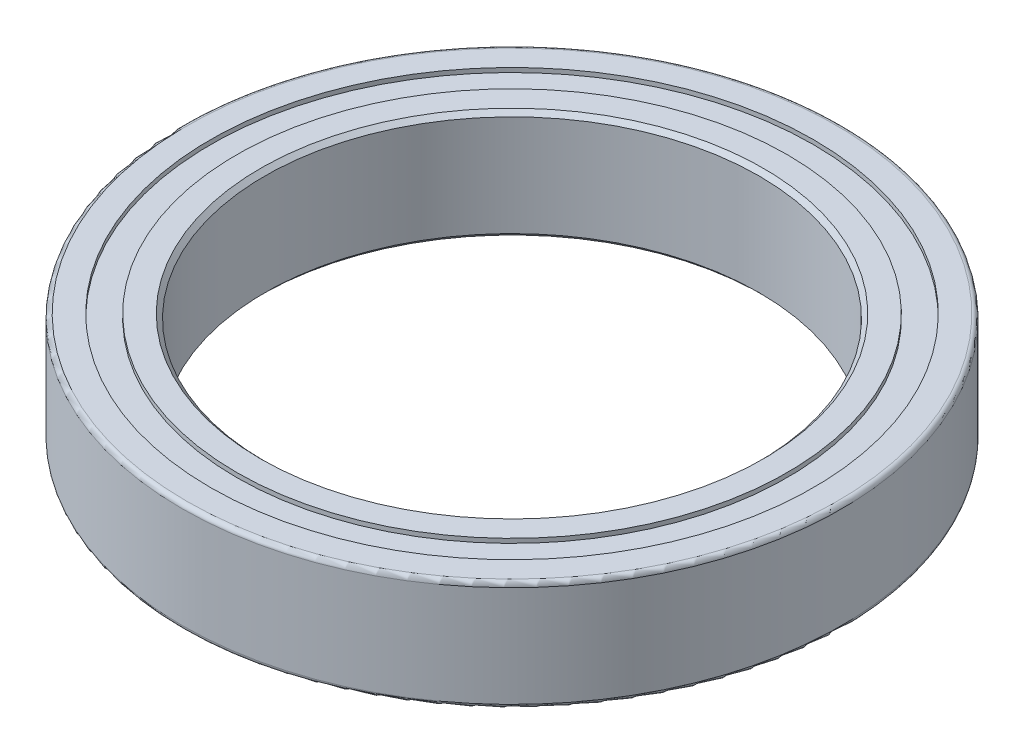
ISO-10303-21;
HEADER;
FILE_DESCRIPTION(('STEP AP214'),'2;1');
FILE_NAME('part.step','',(''),(''),'','','');
FILE_SCHEMA(('AUTOMOTIVE_DESIGN { 1 0 10303 214 1 1 1 1 }'));
ENDSEC;
DATA;
#1=APPLICATION_CONTEXT('core data for automotive mechanical design processes');
#2=APPLICATION_PROTOCOL_DEFINITION('international standard','automotive_design',2000,#1);
#3=PRODUCT_CONTEXT('',#1,'mechanical');
#4=PRODUCT('Part','Part','',(#3));
#5=PRODUCT_RELATED_PRODUCT_CATEGORY('part','',(#4));
#6=PRODUCT_DEFINITION_FORMATION('','',#4);
#7=PRODUCT_DEFINITION_CONTEXT('part definition',#1,'design');
#8=PRODUCT_DEFINITION('design','',#6,#7);
#9=PRODUCT_DEFINITION_SHAPE('','',#8);
#10=(LENGTH_UNIT() NAMED_UNIT(*) SI_UNIT(.MILLI.,.METRE.));
#11=(NAMED_UNIT(*) PLANE_ANGLE_UNIT() SI_UNIT($,.RADIAN.));
#12=(NAMED_UNIT(*) SI_UNIT($,.STERADIAN.) SOLID_ANGLE_UNIT());
#13=UNCERTAINTY_MEASURE_WITH_UNIT(LENGTH_MEASURE(1.E-05),#10,'distance_accuracy_value','');
#14=(GEOMETRIC_REPRESENTATION_CONTEXT(3) GLOBAL_UNCERTAINTY_ASSIGNED_CONTEXT((#13)) GLOBAL_UNIT_ASSIGNED_CONTEXT((#10,
#11,#12)) REPRESENTATION_CONTEXT('',''));
#15=CARTESIAN_POINT('',(0.,0.,0.));
#16=DIRECTION('',(0.,0.,1.));
#17=DIRECTION('',(1.,0.,0.));
#18=AXIS2_PLACEMENT_3D('',#15,#16,#17);
#19=CARTESIAN_POINT('',(0.,1.5875,0.));
#20=DIRECTION('',(0.,-1.,0.));
#21=DIRECTION('',(0.,0.,-1.));
#22=AXIS2_PLACEMENT_3D('',#19,#20,#21);
#23=CYLINDRICAL_SURFACE('',#22,8.7122);
#24=CARTESIAN_POINT('',(0.,-1.5875,0.));
#25=DIRECTION('',(0.,1.,0.));
#26=DIRECTION('',(0.,0.,1.));
#27=AXIS2_PLACEMENT_3D('',#24,#25,#26);
#28=CIRCLE('',#27,8.7122);
#29=CARTESIAN_POINT('',(0.,-1.5875,8.7122));
#30=VERTEX_POINT('',#29);
#31=EDGE_CURVE('E69',#30,#30,#28,.T.);
#32=ORIENTED_EDGE('',*,*,#31,.F.);
#33=EDGE_LOOP('',(#32));
#34=FACE_BOUND('',#33,.T.);
#35=CARTESIAN_POINT('',(0.,-1.4605,0.));
#36=DIRECTION('',(0.,1.,0.));
#37=DIRECTION('',(0.,0.,1.));
#38=AXIS2_PLACEMENT_3D('',#35,#36,#37);
#39=CIRCLE('',#38,8.7122);
#40=CARTESIAN_POINT('',(0.,-1.4605,8.7122));
#41=VERTEX_POINT('',#40);
#42=EDGE_CURVE('E72',#41,#41,#39,.T.);
#43=ORIENTED_EDGE('',*,*,#42,.T.);
#44=EDGE_LOOP('',(#43));
#45=FACE_BOUND('',#44,.T.);
#46=ADVANCED_FACE('F45',(#34,#45),#23,.F.);
#47=CARTESIAN_POINT('',(0.,1.4605,0.));
#48=DIRECTION('',(0.,1.,0.));
#49=DIRECTION('',(0.,0.,1.));
#50=AXIS2_PLACEMENT_3D('',#47,#48,#49);
#51=CIRCLE('',#50,8.7122);
#52=CARTESIAN_POINT('',(0.,1.4605,8.7122));
#53=VERTEX_POINT('',#52);
#54=EDGE_CURVE('E11',#53,#53,#51,.T.);
#55=ORIENTED_EDGE('',*,*,#54,.F.);
#56=EDGE_LOOP('',(#55));
#57=FACE_BOUND('',#56,.T.);
#58=CARTESIAN_POINT('',(0.,1.5875,0.));
#59=DIRECTION('',(0.,1.,0.));
#60=DIRECTION('',(0.,0.,1.));
#61=AXIS2_PLACEMENT_3D('',#58,#59,#60);
#62=CIRCLE('',#61,8.7122);
#63=CARTESIAN_POINT('',(0.,1.5875,8.7122));
#64=VERTEX_POINT('',#63);
#65=EDGE_CURVE('E68',#64,#64,#62,.T.);
#66=ORIENTED_EDGE('',*,*,#65,.T.);
#67=EDGE_LOOP('',(#66));
#68=FACE_BOUND('',#67,.T.);
#69=ADVANCED_FACE('F124',(#57,#68),#23,.F.);
#70=CARTESIAN_POINT('',(0.,1.5875,0.));
#71=DIRECTION('',(0.,-1.,0.));
#72=DIRECTION('',(0.,0.,-1.));
#73=AXIS2_PLACEMENT_3D('',#70,#71,#72);
#74=CYLINDRICAL_SURFACE('',#73,9.525);
#75=CARTESIAN_POINT('',(0.,-1.4605,0.));
#76=DIRECTION('',(0.,1.,0.));
#77=DIRECTION('',(0.,0.,1.));
#78=AXIS2_PLACEMENT_3D('',#75,#76,#77);
#79=CIRCLE('',#78,9.525);
#80=CARTESIAN_POINT('',(0.,-1.4605,9.525));
#81=VERTEX_POINT('',#80);
#82=EDGE_CURVE('E60',#81,#81,#79,.T.);
#83=ORIENTED_EDGE('',*,*,#82,.T.);
#84=EDGE_LOOP('',(#83));
#85=FACE_BOUND('',#84,.T.);
#86=CARTESIAN_POINT('',(0.,1.4605,0.));
#87=DIRECTION('',(0.,1.,0.));
#88=DIRECTION('',(0.,0.,1.));
#89=AXIS2_PLACEMENT_3D('',#86,#87,#88);
#90=CIRCLE('',#89,9.525);
#91=CARTESIAN_POINT('',(0.,1.4605,9.525));
#92=VERTEX_POINT('',#91);
#93=EDGE_CURVE('E65',#92,#92,#90,.F.);
#94=ORIENTED_EDGE('',*,*,#93,.T.);
#95=EDGE_LOOP('',(#94));
#96=FACE_BOUND('',#95,.T.);
#97=ADVANCED_FACE('F131',(#85,#96),#74,.T.);
#98=CARTESIAN_POINT('',(0.,1.5875,0.));
#99=DIRECTION('',(0.,1.,0.));
#100=DIRECTION('',(0.,0.,1.));
#101=AXIS2_PLACEMENT_3D('',#98,#99,#100);
#102=PLANE('',#101);
#103=CARTESIAN_POINT('',(0.,1.5875,0.));
#104=DIRECTION('',(0.,1.,0.));
#105=DIRECTION('',(0.,0.,1.));
#106=AXIS2_PLACEMENT_3D('',#103,#104,#105);
#107=CIRCLE('',#106,9.398);
#108=CARTESIAN_POINT('',(0.,1.5875,9.398));
#109=VERTEX_POINT('',#108);
#110=EDGE_CURVE('E52',#109,#109,#107,.T.);
#111=ORIENTED_EDGE('',*,*,#110,.T.);
#112=EDGE_LOOP('',(#111));
#113=FACE_BOUND('',#112,.T.);
#114=ORIENTED_EDGE('',*,*,#65,.F.);
#115=EDGE_LOOP('',(#114));
#116=FACE_BOUND('',#115,.T.);
#117=ADVANCED_FACE('F148',(#113,#116),#102,.T.);
#118=CARTESIAN_POINT('',(0.,-1.5875,0.));
#119=DIRECTION('',(0.,1.,0.));
#120=DIRECTION('',(0.,0.,1.));
#121=AXIS2_PLACEMENT_3D('',#118,#119,#120);
#122=PLANE('',#121);
#123=CARTESIAN_POINT('',(0.,-1.5875,0.));
#124=DIRECTION('',(0.,1.,0.));
#125=DIRECTION('',(0.,0.,1.));
#126=AXIS2_PLACEMENT_3D('',#123,#124,#125);
#127=CIRCLE('',#126,9.398);
#128=CARTESIAN_POINT('',(0.,-1.5875,9.398));
#129=VERTEX_POINT('',#128);
#130=EDGE_CURVE('E56',#129,#129,#127,.F.);
#131=ORIENTED_EDGE('',*,*,#130,.T.);
#132=EDGE_LOOP('',(#131));
#133=FACE_BOUND('',#132,.T.);
#134=ORIENTED_EDGE('',*,*,#31,.T.);
#135=EDGE_LOOP('',(#134));
#136=FACE_BOUND('',#135,.T.);
#137=ADVANCED_FACE('F139',(#133,#136),#122,.F.);
#138=CARTESIAN_POINT('',(0.,-1.4605,0.));
#139=DIRECTION('',(0.,1.,0.));
#140=DIRECTION('',(0.,0.,1.));
#141=AXIS2_PLACEMENT_3D('',#138,#139,#140);
#142=TOROIDAL_SURFACE('',#141,9.398,0.127);
#143=ORIENTED_EDGE('',*,*,#130,.F.);
#144=EDGE_LOOP('',(#143));
#145=FACE_BOUND('',#144,.T.);
#146=ORIENTED_EDGE('',*,*,#82,.F.);
#147=EDGE_LOOP('',(#146));
#148=FACE_BOUND('',#147,.T.);
#149=ADVANCED_FACE('F137',(#145,#148),#142,.T.);
#150=CARTESIAN_POINT('',(0.,1.4605,0.));
#151=DIRECTION('',(0.,1.,0.));
#152=DIRECTION('',(0.,0.,1.));
#153=AXIS2_PLACEMENT_3D('',#150,#151,#152);
#154=TOROIDAL_SURFACE('',#153,9.398,0.127);
#155=ORIENTED_EDGE('',*,*,#93,.F.);
#156=EDGE_LOOP('',(#155));
#157=FACE_BOUND('',#156,.T.);
#158=ORIENTED_EDGE('',*,*,#110,.F.);
#159=EDGE_LOOP('',(#158));
#160=FACE_BOUND('',#159,.T.);
#161=ADVANCED_FACE('F47',(#157,#160),#154,.T.);
#162=CARTESIAN_POINT('',(0.,1.4605,0.));
#163=DIRECTION('',(0.,1.,0.));
#164=DIRECTION('',(0.,0.,1.));
#165=AXIS2_PLACEMENT_3D('',#162,#163,#164);
#166=PLANE('',#165);
#167=ORIENTED_EDGE('',*,*,#54,.T.);
#168=EDGE_LOOP('',(#167));
#169=FACE_BOUND('',#168,.T.);
#170=CARTESIAN_POINT('',(0.,1.4605,0.));
#171=DIRECTION('',(0.,1.,0.));
#172=DIRECTION('',(0.,0.,1.));
#173=AXIS2_PLACEMENT_3D('',#170,#171,#172);
#174=CIRCLE('',#173,7.95655);
#175=CARTESIAN_POINT('',(0.,1.4605,7.95655));
#176=VERTEX_POINT('',#175);
#177=EDGE_CURVE('E77',#176,#176,#174,.T.);
#178=ORIENTED_EDGE('',*,*,#177,.F.);
#179=EDGE_LOOP('',(#178));
#180=FACE_BOUND('',#179,.T.);
#181=ADVANCED_FACE('F145',(#169,#180),#166,.T.);
#182=CARTESIAN_POINT('',(0.,-1.4605,0.));
#183=DIRECTION('',(0.,1.,0.));
#184=DIRECTION('',(0.,0.,1.));
#185=AXIS2_PLACEMENT_3D('',#182,#183,#184);
#186=PLANE('',#185);
#187=ORIENTED_EDGE('',*,*,#42,.F.);
#188=EDGE_LOOP('',(#187));
#189=FACE_BOUND('',#188,.T.);
#190=CARTESIAN_POINT('',(0.,-1.4605,0.));
#191=DIRECTION('',(0.,1.,0.));
#192=DIRECTION('',(0.,0.,1.));
#193=AXIS2_PLACEMENT_3D('',#190,#191,#192);
#194=CIRCLE('',#193,7.95655);
#195=CARTESIAN_POINT('',(0.,-1.4605,7.95655));
#196=VERTEX_POINT('',#195);
#197=EDGE_CURVE('E80',#196,#196,#194,.F.);
#198=ORIENTED_EDGE('',*,*,#197,.F.);
#199=EDGE_LOOP('',(#198));
#200=FACE_BOUND('',#199,.T.);
#201=ADVANCED_FACE('F121',(#189,#200),#186,.F.);
#202=CARTESIAN_POINT('',(0.,1.5875,0.));
#203=DIRECTION('',(0.,-1.,0.));
#204=DIRECTION('',(0.,0.,-1.));
#205=AXIS2_PLACEMENT_3D('',#202,#203,#204);
#206=CYLINDRICAL_SURFACE('',#205,7.95655);
#207=CARTESIAN_POINT('',(0.,-1.5875,0.));
#208=DIRECTION('',(0.,1.,0.));
#209=DIRECTION('',(0.,0.,1.));
#210=AXIS2_PLACEMENT_3D('',#207,#208,#209);
#211=CIRCLE('',#210,7.95655);
#212=CARTESIAN_POINT('',(0.,-1.5875,7.95655));
#213=VERTEX_POINT('',#212);
#214=EDGE_CURVE('E96',#213,#213,#211,.T.);
#215=ORIENTED_EDGE('',*,*,#214,.T.);
#216=EDGE_LOOP('',(#215));
#217=FACE_BOUND('',#216,.T.);
#218=ORIENTED_EDGE('',*,*,#197,.T.);
#219=EDGE_LOOP('',(#218));
#220=FACE_BOUND('',#219,.T.);
#221=ADVANCED_FACE('F109',(#217,#220),#206,.T.);
#222=CARTESIAN_POINT('',(0.,1.5875,0.));
#223=DIRECTION('',(0.,-1.,0.));
#224=DIRECTION('',(0.,0.,-1.));
#225=AXIS2_PLACEMENT_3D('',#222,#223,#224);
#226=CYLINDRICAL_SURFACE('',#225,7.14375);
#227=CARTESIAN_POINT('',(0.,-1.4605,0.));
#228=DIRECTION('',(0.,1.,0.));
#229=DIRECTION('',(0.,0.,1.));
#230=AXIS2_PLACEMENT_3D('',#227,#228,#229);
#231=CIRCLE('',#230,7.14375);
#232=CARTESIAN_POINT('',(0.,-1.4605,7.14375));
#233=VERTEX_POINT('',#232);
#234=EDGE_CURVE('E86',#233,#233,#231,.F.);
#235=ORIENTED_EDGE('',*,*,#234,.T.);
#236=EDGE_LOOP('',(#235));
#237=FACE_BOUND('',#236,.T.);
#238=CARTESIAN_POINT('',(0.,1.4605,0.));
#239=DIRECTION('',(0.,1.,0.));
#240=DIRECTION('',(0.,0.,1.));
#241=AXIS2_PLACEMENT_3D('',#238,#239,#240);
#242=CIRCLE('',#241,7.14375);
#243=CARTESIAN_POINT('',(0.,1.4605,7.14375));
#244=VERTEX_POINT('',#243);
#245=EDGE_CURVE('E89',#244,#244,#242,.T.);
#246=ORIENTED_EDGE('',*,*,#245,.T.);
#247=EDGE_LOOP('',(#246));
#248=FACE_BOUND('',#247,.T.);
#249=ADVANCED_FACE('F106',(#237,#248),#226,.F.);
#250=ORIENTED_EDGE('',*,*,#177,.T.);
#251=EDGE_LOOP('',(#250));
#252=FACE_BOUND('',#251,.T.);
#253=CARTESIAN_POINT('',(0.,1.5875,0.));
#254=DIRECTION('',(0.,1.,0.));
#255=DIRECTION('',(0.,0.,1.));
#256=AXIS2_PLACEMENT_3D('',#253,#254,#255);
#257=CIRCLE('',#256,7.95655);
#258=CARTESIAN_POINT('',(0.,1.5875,7.95655));
#259=VERTEX_POINT('',#258);
#260=EDGE_CURVE('E95',#259,#259,#257,.T.);
#261=ORIENTED_EDGE('',*,*,#260,.F.);
#262=EDGE_LOOP('',(#261));
#263=FACE_BOUND('',#262,.T.);
#264=ADVANCED_FACE('F104',(#252,#263),#206,.T.);
#265=CARTESIAN_POINT('',(0.,1.5875,0.));
#266=DIRECTION('',(0.,1.,0.));
#267=DIRECTION('',(0.,0.,1.));
#268=AXIS2_PLACEMENT_3D('',#265,#266,#267);
#269=PLANE('',#268);
#270=CARTESIAN_POINT('',(0.,1.5875,0.));
#271=DIRECTION('',(0.,1.,0.));
#272=DIRECTION('',(0.,0.,1.));
#273=AXIS2_PLACEMENT_3D('',#270,#271,#272);
#274=CIRCLE('',#273,7.27075);
#275=CARTESIAN_POINT('',(0.,1.5875,7.27075));
#276=VERTEX_POINT('',#275);
#277=EDGE_CURVE('E83',#276,#276,#274,.F.);
#278=ORIENTED_EDGE('',*,*,#277,.T.);
#279=EDGE_LOOP('',(#278));
#280=FACE_BOUND('',#279,.T.);
#281=ORIENTED_EDGE('',*,*,#260,.T.);
#282=EDGE_LOOP('',(#281));
#283=FACE_BOUND('',#282,.T.);
#284=ADVANCED_FACE('F102',(#280,#283),#269,.T.);
#285=CARTESIAN_POINT('',(0.,-1.5875,0.));
#286=DIRECTION('',(0.,1.,0.));
#287=DIRECTION('',(0.,0.,1.));
#288=AXIS2_PLACEMENT_3D('',#285,#286,#287);
#289=PLANE('',#288);
#290=CARTESIAN_POINT('',(0.,-1.5875,0.));
#291=DIRECTION('',(0.,1.,0.));
#292=DIRECTION('',(0.,0.,1.));
#293=AXIS2_PLACEMENT_3D('',#290,#291,#292);
#294=CIRCLE('',#293,7.27075);
#295=CARTESIAN_POINT('',(0.,-1.5875,7.27075));
#296=VERTEX_POINT('',#295);
#297=EDGE_CURVE('E92',#296,#296,#294,.T.);
#298=ORIENTED_EDGE('',*,*,#297,.T.);
#299=EDGE_LOOP('',(#298));
#300=FACE_BOUND('',#299,.T.);
#301=ORIENTED_EDGE('',*,*,#214,.F.);
#302=EDGE_LOOP('',(#301));
#303=FACE_BOUND('',#302,.T.);
#304=ADVANCED_FACE('F114',(#300,#303),#289,.F.);
#305=CARTESIAN_POINT('',(0.,-1.5875,0.));
#306=DIRECTION('',(0.,-1.,0.));
#307=DIRECTION('',(0.,0.,-1.));
#308=AXIS2_PLACEMENT_3D('',#305,#306,#307);
#309=CONICAL_SURFACE('',#308,7.27075,0.785398163397448);
#310=ORIENTED_EDGE('',*,*,#234,.F.);
#311=EDGE_LOOP('',(#310));
#312=FACE_BOUND('',#311,.T.);
#313=ORIENTED_EDGE('',*,*,#297,.F.);
#314=EDGE_LOOP('',(#313));
#315=FACE_BOUND('',#314,.T.);
#316=ADVANCED_FACE('F178',(#312,#315),#309,.F.);
#317=CARTESIAN_POINT('',(0.,1.4605,0.));
#318=DIRECTION('',(0.,1.,0.));
#319=DIRECTION('',(0.,0.,1.));
#320=AXIS2_PLACEMENT_3D('',#317,#318,#319);
#321=CONICAL_SURFACE('',#320,7.14375,0.785398163397448);
#322=ORIENTED_EDGE('',*,*,#277,.F.);
#323=EDGE_LOOP('',(#322));
#324=FACE_BOUND('',#323,.T.);
#325=ORIENTED_EDGE('',*,*,#245,.F.);
#326=EDGE_LOOP('',(#325));
#327=FACE_BOUND('',#326,.T.);
#328=ADVANCED_FACE('F172',(#324,#327),#321,.F.);
#329=CLOSED_SHELL('',(#46,#69,#97,#117,#137,#149,#161,#181,#201,#221,#249,#264,#284,#304,#316,#328));
#330=MANIFOLD_SOLID_BREP('B2',#329);
#331=ADVANCED_BREP_SHAPE_REPRESENTATION('',(#18,#330),#14);
#332=SHAPE_DEFINITION_REPRESENTATION(#9,#331);
ENDSEC;
END-ISO-10303-21;
